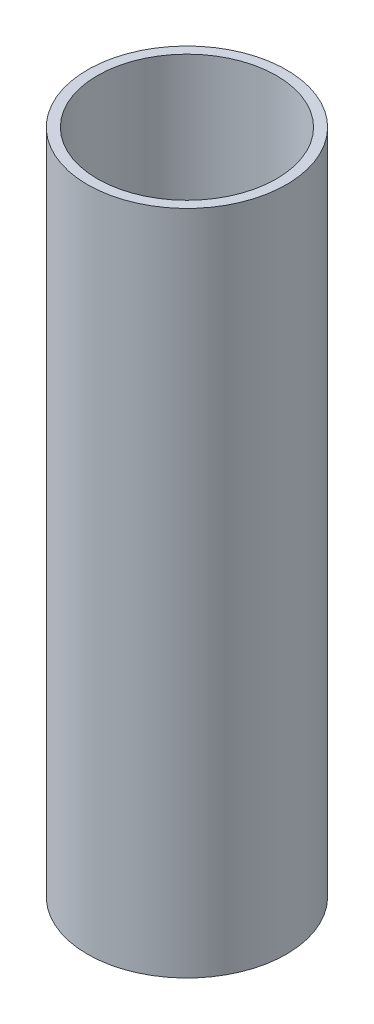
ISO-10303-21;
HEADER;
FILE_DESCRIPTION(('STEP AP214'),'2;1');
FILE_NAME('part.step','',(''),(''),'','','');
FILE_SCHEMA(('AUTOMOTIVE_DESIGN { 1 0 10303 214 1 1 1 1 }'));
ENDSEC;
DATA;
#1=APPLICATION_CONTEXT('core data for automotive mechanical design processes');
#2=APPLICATION_PROTOCOL_DEFINITION('international standard','automotive_design',2000,#1);
#3=PRODUCT_CONTEXT('',#1,'mechanical');
#4=PRODUCT('Part','Part','',(#3));
#5=PRODUCT_RELATED_PRODUCT_CATEGORY('part','',(#4));
#6=PRODUCT_DEFINITION_FORMATION('','',#4);
#7=PRODUCT_DEFINITION_CONTEXT('part definition',#1,'design');
#8=PRODUCT_DEFINITION('design','',#6,#7);
#9=PRODUCT_DEFINITION_SHAPE('','',#8);
#10=(LENGTH_UNIT() NAMED_UNIT(*) SI_UNIT(.MILLI.,.METRE.));
#11=(NAMED_UNIT(*) PLANE_ANGLE_UNIT() SI_UNIT($,.RADIAN.));
#12=(NAMED_UNIT(*) SI_UNIT($,.STERADIAN.) SOLID_ANGLE_UNIT());
#13=UNCERTAINTY_MEASURE_WITH_UNIT(LENGTH_MEASURE(1.E-05),#10,'distance_accuracy_value','');
#14=(GEOMETRIC_REPRESENTATION_CONTEXT(3) GLOBAL_UNCERTAINTY_ASSIGNED_CONTEXT((#13)) GLOBAL_UNIT_ASSIGNED_CONTEXT((#10,
#11,#12)) REPRESENTATION_CONTEXT('',''));
#15=CARTESIAN_POINT('',(0.,0.,0.));
#16=DIRECTION('',(0.,0.,1.));
#17=DIRECTION('',(1.,0.,0.));
#18=AXIS2_PLACEMENT_3D('',#15,#16,#17);
#19=CARTESIAN_POINT('',(0.,67.,0.));
#20=DIRECTION('',(0.,1.,0.));
#21=DIRECTION('',(0.,0.,1.));
#22=AXIS2_PLACEMENT_3D('',#19,#20,#21);
#23=PLANE('',#22);
#24=CARTESIAN_POINT('',(0.,67.,0.));
#25=DIRECTION('',(0.,1.,0.));
#26=DIRECTION('',(0.,0.,1.));
#27=AXIS2_PLACEMENT_3D('',#24,#25,#26);
#28=CIRCLE('',#27,10.);
#29=CARTESIAN_POINT('',(0.,67.,10.));
#30=VERTEX_POINT('',#29);
#31=EDGE_CURVE('E10',#30,#30,#28,.T.);
#32=ORIENTED_EDGE('',*,*,#31,.T.);
#33=EDGE_LOOP('',(#32));
#34=FACE_BOUND('',#33,.T.);
#35=CARTESIAN_POINT('',(0.,67.,0.));
#36=DIRECTION('',(0.,1.,0.));
#37=DIRECTION('',(0.,0.,1.));
#38=AXIS2_PLACEMENT_3D('',#35,#36,#37);
#39=CIRCLE('',#38,9.);
#40=CARTESIAN_POINT('',(0.,67.,9.));
#41=VERTEX_POINT('',#40);
#42=EDGE_CURVE('E50',#41,#41,#39,.T.);
#43=ORIENTED_EDGE('',*,*,#42,.F.);
#44=EDGE_LOOP('',(#43));
#45=FACE_BOUND('',#44,.T.);
#46=ADVANCED_FACE('F37',(#34,#45),#23,.T.);
#47=CARTESIAN_POINT('',(0.,0.,0.));
#48=DIRECTION('',(0.,1.,0.));
#49=DIRECTION('',(0.,0.,1.));
#50=AXIS2_PLACEMENT_3D('',#47,#48,#49);
#51=PLANE('',#50);
#52=CARTESIAN_POINT('',(0.,0.,0.));
#53=DIRECTION('',(0.,1.,0.));
#54=DIRECTION('',(0.,0.,1.));
#55=AXIS2_PLACEMENT_3D('',#52,#53,#54);
#56=CIRCLE('',#55,10.);
#57=CARTESIAN_POINT('',(0.,0.,10.));
#58=VERTEX_POINT('',#57);
#59=EDGE_CURVE('E41',#58,#58,#56,.T.);
#60=ORIENTED_EDGE('',*,*,#59,.F.);
#61=EDGE_LOOP('',(#60));
#62=FACE_BOUND('',#61,.T.);
#63=CARTESIAN_POINT('',(0.,0.,0.));
#64=DIRECTION('',(0.,1.,0.));
#65=DIRECTION('',(0.,0.,1.));
#66=AXIS2_PLACEMENT_3D('',#63,#64,#65);
#67=CIRCLE('',#66,9.);
#68=CARTESIAN_POINT('',(0.,0.,9.));
#69=VERTEX_POINT('',#68);
#70=EDGE_CURVE('E52',#69,#69,#67,.T.);
#71=ORIENTED_EDGE('',*,*,#70,.T.);
#72=EDGE_LOOP('',(#71));
#73=FACE_BOUND('',#72,.T.);
#74=ADVANCED_FACE('F64',(#62,#73),#51,.F.);
#75=CARTESIAN_POINT('',(0.,67.,0.));
#76=DIRECTION('',(0.,-1.,0.));
#77=DIRECTION('',(0.,0.,-1.));
#78=AXIS2_PLACEMENT_3D('',#75,#76,#77);
#79=CYLINDRICAL_SURFACE('',#78,10.);
#80=ORIENTED_EDGE('',*,*,#31,.F.);
#81=EDGE_LOOP('',(#80));
#82=FACE_BOUND('',#81,.T.);
#83=ORIENTED_EDGE('',*,*,#59,.T.);
#84=EDGE_LOOP('',(#83));
#85=FACE_BOUND('',#84,.T.);
#86=ADVANCED_FACE('F39',(#82,#85),#79,.T.);
#87=CARTESIAN_POINT('',(0.,67.,0.));
#88=DIRECTION('',(0.,-1.,0.));
#89=DIRECTION('',(0.,0.,-1.));
#90=AXIS2_PLACEMENT_3D('',#87,#88,#89);
#91=CYLINDRICAL_SURFACE('',#90,9.);
#92=ORIENTED_EDGE('',*,*,#42,.T.);
#93=EDGE_LOOP('',(#92));
#94=FACE_BOUND('',#93,.T.);
#95=ORIENTED_EDGE('',*,*,#70,.F.);
#96=EDGE_LOOP('',(#95));
#97=FACE_BOUND('',#96,.T.);
#98=ADVANCED_FACE('F60',(#94,#97),#91,.F.);
#99=CLOSED_SHELL('',(#46,#74,#86,#98));
#100=MANIFOLD_SOLID_BREP('B2',#99);
#101=ADVANCED_BREP_SHAPE_REPRESENTATION('',(#18,#100),#14);
#102=SHAPE_DEFINITION_REPRESENTATION(#9,#101);
ENDSEC;
END-ISO-10303-21;
